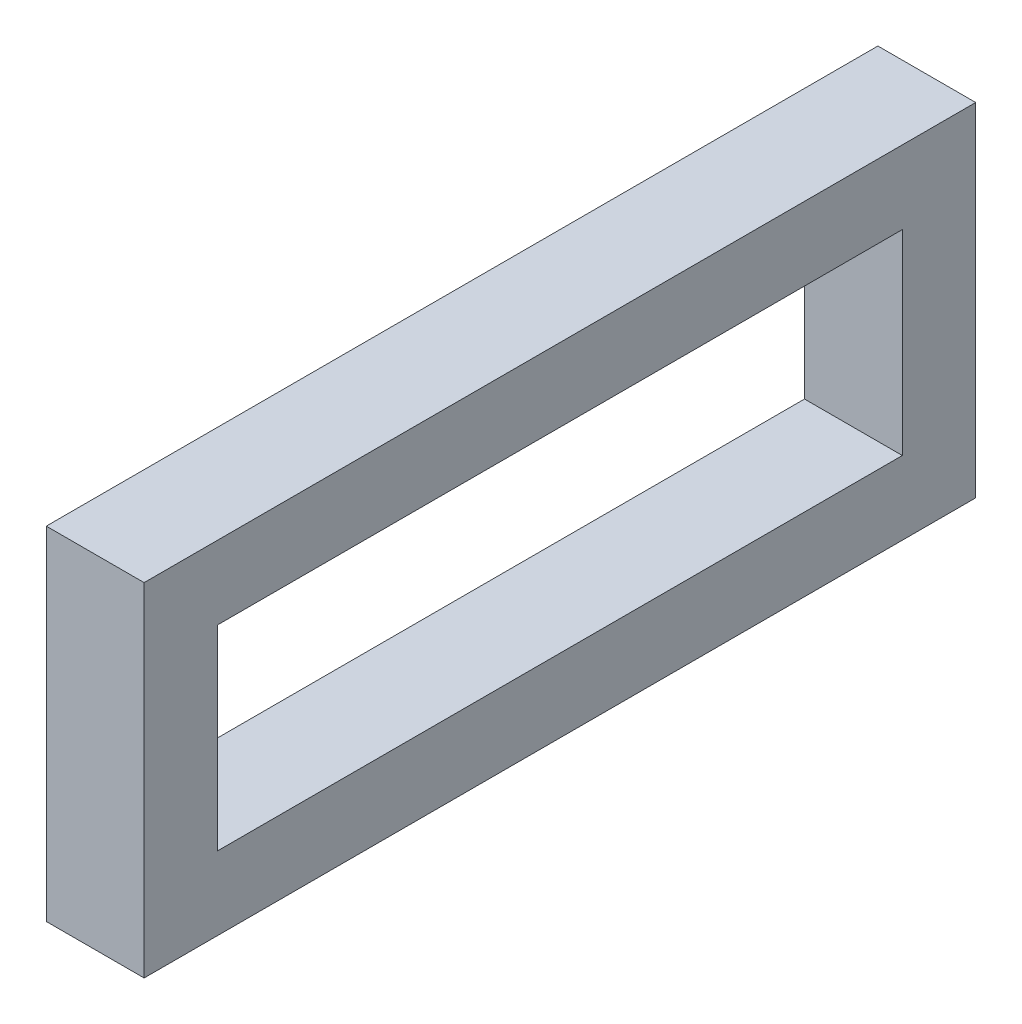
ISO-10303-21;
HEADER;
FILE_DESCRIPTION(('STEP AP214'),'2;1');
FILE_NAME('part.step','',(''),(''),'','','');
FILE_SCHEMA(('AUTOMOTIVE_DESIGN { 1 0 10303 214 1 1 1 1 }'));
ENDSEC;
DATA;
#1=APPLICATION_CONTEXT('core data for automotive mechanical design processes');
#2=APPLICATION_PROTOCOL_DEFINITION('international standard','automotive_design',2000,#1);
#3=PRODUCT_CONTEXT('',#1,'mechanical');
#4=PRODUCT('Part','Part','',(#3));
#5=PRODUCT_RELATED_PRODUCT_CATEGORY('part','',(#4));
#6=PRODUCT_DEFINITION_FORMATION('','',#4);
#7=PRODUCT_DEFINITION_CONTEXT('part definition',#1,'design');
#8=PRODUCT_DEFINITION('design','',#6,#7);
#9=PRODUCT_DEFINITION_SHAPE('','',#8);
#10=(LENGTH_UNIT() NAMED_UNIT(*) SI_UNIT(.MILLI.,.METRE.));
#11=(NAMED_UNIT(*) PLANE_ANGLE_UNIT() SI_UNIT($,.RADIAN.));
#12=(NAMED_UNIT(*) SI_UNIT($,.STERADIAN.) SOLID_ANGLE_UNIT());
#13=UNCERTAINTY_MEASURE_WITH_UNIT(LENGTH_MEASURE(1.E-05),#10,'distance_accuracy_value','');
#14=(GEOMETRIC_REPRESENTATION_CONTEXT(3) GLOBAL_UNCERTAINTY_ASSIGNED_CONTEXT((#13)) GLOBAL_UNIT_ASSIGNED_CONTEXT((#10,
#11,#12)) REPRESENTATION_CONTEXT('',''));
#15=CARTESIAN_POINT('',(0.,0.,0.));
#16=DIRECTION('',(0.,0.,1.));
#17=DIRECTION('',(1.,0.,0.));
#18=AXIS2_PLACEMENT_3D('',#15,#16,#17);
#19=CARTESIAN_POINT('',(20.,0.,0.));
#20=DIRECTION('',(1.,0.,0.));
#21=DIRECTION('',(0.,0.,-1.));
#22=AXIS2_PLACEMENT_3D('',#19,#20,#21);
#23=PLANE('',#22);
#24=DIRECTION('',(0.,-1.,0.));
#25=VECTOR('',#24,1.);
#26=CARTESIAN_POINT('',(20.,-35.,85.));
#27=LINE('',#26,#25);
#28=CARTESIAN_POINT('',(20.,35.,85.));
#29=VERTEX_POINT('',#28);
#30=CARTESIAN_POINT('',(20.,-35.,85.));
#31=VERTEX_POINT('',#30);
#32=EDGE_CURVE('E134',#29,#31,#27,.T.);
#33=ORIENTED_EDGE('',*,*,#32,.T.);
#34=DIRECTION('',(0.,0.,-1.));
#35=VECTOR('',#34,1.);
#36=CARTESIAN_POINT('',(20.,-35.,-85.));
#37=LINE('',#36,#35);
#38=CARTESIAN_POINT('',(20.,-35.,-85.));
#39=VERTEX_POINT('',#38);
#40=EDGE_CURVE('E137',#31,#39,#37,.T.);
#41=ORIENTED_EDGE('',*,*,#40,.T.);
#42=DIRECTION('',(0.,1.,0.));
#43=VECTOR('',#42,1.);
#44=CARTESIAN_POINT('',(20.,-35.,-85.));
#45=LINE('',#44,#43);
#46=CARTESIAN_POINT('',(20.,35.,-85.));
#47=VERTEX_POINT('',#46);
#48=EDGE_CURVE('E140',#39,#47,#45,.T.);
#49=ORIENTED_EDGE('',*,*,#48,.T.);
#50=DIRECTION('',(0.,0.,1.));
#51=VECTOR('',#50,1.);
#52=CARTESIAN_POINT('',(20.,35.,-85.));
#53=LINE('',#52,#51);
#54=EDGE_CURVE('E142',#47,#29,#53,.T.);
#55=ORIENTED_EDGE('',*,*,#54,.T.);
#56=EDGE_LOOP('',(#33,#41,#49,#55));
#57=FACE_BOUND('',#56,.T.);
#58=DIRECTION('',(0.,0.,-1.));
#59=VECTOR('',#58,1.);
#60=CARTESIAN_POINT('',(20.,-20.,-70.));
#61=LINE('',#60,#59);
#62=CARTESIAN_POINT('',(20.,-20.,70.));
#63=VERTEX_POINT('',#62);
#64=CARTESIAN_POINT('',(20.,-20.,-70.));
#65=VERTEX_POINT('',#64);
#66=EDGE_CURVE('E106',#63,#65,#61,.T.);
#67=ORIENTED_EDGE('',*,*,#66,.F.);
#68=DIRECTION('',(0.,-1.,0.));
#69=VECTOR('',#68,1.);
#70=CARTESIAN_POINT('',(20.,-20.,70.));
#71=LINE('',#70,#69);
#72=CARTESIAN_POINT('',(20.,20.,70.));
#73=VERTEX_POINT('',#72);
#74=EDGE_CURVE('E98',#73,#63,#71,.T.);
#75=ORIENTED_EDGE('',*,*,#74,.F.);
#76=DIRECTION('',(0.,0.,1.));
#77=VECTOR('',#76,1.);
#78=CARTESIAN_POINT('',(20.,20.,-70.));
#79=LINE('',#78,#77);
#80=CARTESIAN_POINT('',(20.,20.,-70.));
#81=VERTEX_POINT('',#80);
#82=EDGE_CURVE('E120',#81,#73,#79,.T.);
#83=ORIENTED_EDGE('',*,*,#82,.F.);
#84=DIRECTION('',(0.,1.,0.));
#85=VECTOR('',#84,1.);
#86=CARTESIAN_POINT('',(20.,-20.,-70.));
#87=LINE('',#86,#85);
#88=EDGE_CURVE('E118',#65,#81,#87,.T.);
#89=ORIENTED_EDGE('',*,*,#88,.F.);
#90=EDGE_LOOP('',(#67,#75,#83,#89));
#91=FACE_BOUND('',#90,.T.);
#92=ADVANCED_FACE('F33',(#57,#91),#23,.T.);
#93=CARTESIAN_POINT('',(0.,0.,0.));
#94=DIRECTION('',(1.,0.,0.));
#95=DIRECTION('',(0.,0.,-1.));
#96=AXIS2_PLACEMENT_3D('',#93,#94,#95);
#97=PLANE('',#96);
#98=DIRECTION('',(0.,-1.,0.));
#99=VECTOR('',#98,1.);
#100=CARTESIAN_POINT('',(0.,-35.,85.));
#101=LINE('',#100,#99);
#102=CARTESIAN_POINT('',(0.,35.,85.));
#103=VERTEX_POINT('',#102);
#104=CARTESIAN_POINT('',(0.,-35.,85.));
#105=VERTEX_POINT('',#104);
#106=EDGE_CURVE('E114',#103,#105,#101,.T.);
#107=ORIENTED_EDGE('',*,*,#106,.F.);
#108=DIRECTION('',(0.,0.,1.));
#109=VECTOR('',#108,1.);
#110=CARTESIAN_POINT('',(0.,35.,-85.));
#111=LINE('',#110,#109);
#112=CARTESIAN_POINT('',(0.,35.,-85.));
#113=VERTEX_POINT('',#112);
#114=EDGE_CURVE('E138',#113,#103,#111,.T.);
#115=ORIENTED_EDGE('',*,*,#114,.F.);
#116=DIRECTION('',(0.,1.,0.));
#117=VECTOR('',#116,1.);
#118=CARTESIAN_POINT('',(0.,-35.,-85.));
#119=LINE('',#118,#117);
#120=CARTESIAN_POINT('',(0.,-35.,-85.));
#121=VERTEX_POINT('',#120);
#122=EDGE_CURVE('E149',#121,#113,#119,.T.);
#123=ORIENTED_EDGE('',*,*,#122,.F.);
#124=DIRECTION('',(0.,0.,-1.));
#125=VECTOR('',#124,1.);
#126=CARTESIAN_POINT('',(0.,-35.,-85.));
#127=LINE('',#126,#125);
#128=EDGE_CURVE('E147',#105,#121,#127,.T.);
#129=ORIENTED_EDGE('',*,*,#128,.F.);
#130=EDGE_LOOP('',(#107,#115,#123,#129));
#131=FACE_BOUND('',#130,.T.);
#132=DIRECTION('',(0.,-1.,0.));
#133=VECTOR('',#132,1.);
#134=CARTESIAN_POINT('',(0.,-20.,70.));
#135=LINE('',#134,#133);
#136=CARTESIAN_POINT('',(0.,20.,70.));
#137=VERTEX_POINT('',#136);
#138=CARTESIAN_POINT('',(0.,-20.,70.));
#139=VERTEX_POINT('',#138);
#140=EDGE_CURVE('E56',#137,#139,#135,.T.);
#141=ORIENTED_EDGE('',*,*,#140,.T.);
#142=DIRECTION('',(0.,0.,-1.));
#143=VECTOR('',#142,1.);
#144=CARTESIAN_POINT('',(0.,-20.,-70.));
#145=LINE('',#144,#143);
#146=CARTESIAN_POINT('',(0.,-20.,-70.));
#147=VERTEX_POINT('',#146);
#148=EDGE_CURVE('E113',#139,#147,#145,.T.);
#149=ORIENTED_EDGE('',*,*,#148,.T.);
#150=DIRECTION('',(0.,1.,0.));
#151=VECTOR('',#150,1.);
#152=CARTESIAN_POINT('',(0.,-20.,-70.));
#153=LINE('',#152,#151);
#154=CARTESIAN_POINT('',(0.,20.,-70.));
#155=VERTEX_POINT('',#154);
#156=EDGE_CURVE('E126',#147,#155,#153,.T.);
#157=ORIENTED_EDGE('',*,*,#156,.T.);
#158=DIRECTION('',(0.,0.,1.));
#159=VECTOR('',#158,1.);
#160=CARTESIAN_POINT('',(0.,20.,-70.));
#161=LINE('',#160,#159);
#162=EDGE_CURVE('E107',#155,#137,#161,.T.);
#163=ORIENTED_EDGE('',*,*,#162,.T.);
#164=EDGE_LOOP('',(#141,#149,#157,#163));
#165=FACE_BOUND('',#164,.T.);
#166=ADVANCED_FACE('F167',(#131,#165),#97,.F.);
#167=CARTESIAN_POINT('',(20.,-35.,85.));
#168=DIRECTION('',(0.,0.,-1.));
#169=DIRECTION('',(-1.,0.,0.));
#170=AXIS2_PLACEMENT_3D('',#167,#168,#169);
#171=PLANE('',#170);
#172=ORIENTED_EDGE('',*,*,#106,.T.);
#173=DIRECTION('',(-1.,0.,0.));
#174=VECTOR('',#173,1.);
#175=CARTESIAN_POINT('',(20.,-35.,85.));
#176=LINE('',#175,#174);
#177=EDGE_CURVE('E11',#31,#105,#176,.T.);
#178=ORIENTED_EDGE('',*,*,#177,.F.);
#179=ORIENTED_EDGE('',*,*,#32,.F.);
#180=DIRECTION('',(-1.,0.,0.));
#181=VECTOR('',#180,1.);
#182=CARTESIAN_POINT('',(20.,35.,85.));
#183=LINE('',#182,#181);
#184=EDGE_CURVE('E144',#29,#103,#183,.T.);
#185=ORIENTED_EDGE('',*,*,#184,.T.);
#186=EDGE_LOOP('',(#172,#178,#179,#185));
#187=FACE_BOUND('',#186,.T.);
#188=ADVANCED_FACE('F35',(#187),#171,.F.);
#189=CARTESIAN_POINT('',(20.,-35.,-85.));
#190=DIRECTION('',(0.,1.,0.));
#191=DIRECTION('',(0.,0.,1.));
#192=AXIS2_PLACEMENT_3D('',#189,#190,#191);
#193=PLANE('',#192);
#194=ORIENTED_EDGE('',*,*,#128,.T.);
#195=DIRECTION('',(-1.,0.,0.));
#196=VECTOR('',#195,1.);
#197=CARTESIAN_POINT('',(20.,-35.,-85.));
#198=LINE('',#197,#196);
#199=EDGE_CURVE('E41',#39,#121,#198,.T.);
#200=ORIENTED_EDGE('',*,*,#199,.F.);
#201=ORIENTED_EDGE('',*,*,#40,.F.);
#202=ORIENTED_EDGE('',*,*,#177,.T.);
#203=EDGE_LOOP('',(#194,#200,#201,#202));
#204=FACE_BOUND('',#203,.T.);
#205=ADVANCED_FACE('F177',(#204),#193,.F.);
#206=CARTESIAN_POINT('',(20.,-35.,-85.));
#207=DIRECTION('',(0.,0.,1.));
#208=DIRECTION('',(1.,0.,0.));
#209=AXIS2_PLACEMENT_3D('',#206,#207,#208);
#210=PLANE('',#209);
#211=ORIENTED_EDGE('',*,*,#122,.T.);
#212=DIRECTION('',(-1.,0.,0.));
#213=VECTOR('',#212,1.);
#214=CARTESIAN_POINT('',(20.,35.,-85.));
#215=LINE('',#214,#213);
#216=EDGE_CURVE('E154',#47,#113,#215,.T.);
#217=ORIENTED_EDGE('',*,*,#216,.F.);
#218=ORIENTED_EDGE('',*,*,#48,.F.);
#219=ORIENTED_EDGE('',*,*,#199,.T.);
#220=EDGE_LOOP('',(#211,#217,#218,#219));
#221=FACE_BOUND('',#220,.T.);
#222=ADVANCED_FACE('F161',(#221),#210,.F.);
#223=CARTESIAN_POINT('',(20.,35.,-85.));
#224=DIRECTION('',(0.,-1.,0.));
#225=DIRECTION('',(0.,0.,-1.));
#226=AXIS2_PLACEMENT_3D('',#223,#224,#225);
#227=PLANE('',#226);
#228=ORIENTED_EDGE('',*,*,#114,.T.);
#229=ORIENTED_EDGE('',*,*,#184,.F.);
#230=ORIENTED_EDGE('',*,*,#54,.F.);
#231=ORIENTED_EDGE('',*,*,#216,.T.);
#232=EDGE_LOOP('',(#228,#229,#230,#231));
#233=FACE_BOUND('',#232,.T.);
#234=ADVANCED_FACE('F171',(#233),#227,.F.);
#235=CARTESIAN_POINT('',(20.,-20.,70.));
#236=DIRECTION('',(0.,0.,-1.));
#237=DIRECTION('',(-1.,0.,0.));
#238=AXIS2_PLACEMENT_3D('',#235,#236,#237);
#239=PLANE('',#238);
#240=ORIENTED_EDGE('',*,*,#140,.F.);
#241=DIRECTION('',(-1.,0.,0.));
#242=VECTOR('',#241,1.);
#243=CARTESIAN_POINT('',(20.,20.,70.));
#244=LINE('',#243,#242);
#245=EDGE_CURVE('E102',#73,#137,#244,.T.);
#246=ORIENTED_EDGE('',*,*,#245,.F.);
#247=ORIENTED_EDGE('',*,*,#74,.T.);
#248=DIRECTION('',(-1.,0.,0.));
#249=VECTOR('',#248,1.);
#250=CARTESIAN_POINT('',(20.,-20.,70.));
#251=LINE('',#250,#249);
#252=EDGE_CURVE('E101',#63,#139,#251,.T.);
#253=ORIENTED_EDGE('',*,*,#252,.T.);
#254=EDGE_LOOP('',(#240,#246,#247,#253));
#255=FACE_BOUND('',#254,.T.);
#256=ADVANCED_FACE('F100',(#255),#239,.T.);
#257=CARTESIAN_POINT('',(20.,-20.,-70.));
#258=DIRECTION('',(0.,1.,0.));
#259=DIRECTION('',(0.,0.,1.));
#260=AXIS2_PLACEMENT_3D('',#257,#258,#259);
#261=PLANE('',#260);
#262=ORIENTED_EDGE('',*,*,#148,.F.);
#263=ORIENTED_EDGE('',*,*,#252,.F.);
#264=ORIENTED_EDGE('',*,*,#66,.T.);
#265=DIRECTION('',(-1.,0.,0.));
#266=VECTOR('',#265,1.);
#267=CARTESIAN_POINT('',(20.,-20.,-70.));
#268=LINE('',#267,#266);
#269=EDGE_CURVE('E115',#65,#147,#268,.T.);
#270=ORIENTED_EDGE('',*,*,#269,.T.);
#271=EDGE_LOOP('',(#262,#263,#264,#270));
#272=FACE_BOUND('',#271,.T.);
#273=ADVANCED_FACE('F110',(#272),#261,.T.);
#274=CARTESIAN_POINT('',(20.,-20.,-70.));
#275=DIRECTION('',(0.,0.,1.));
#276=DIRECTION('',(1.,0.,0.));
#277=AXIS2_PLACEMENT_3D('',#274,#275,#276);
#278=PLANE('',#277);
#279=ORIENTED_EDGE('',*,*,#156,.F.);
#280=ORIENTED_EDGE('',*,*,#269,.F.);
#281=ORIENTED_EDGE('',*,*,#88,.T.);
#282=DIRECTION('',(-1.,0.,0.));
#283=VECTOR('',#282,1.);
#284=CARTESIAN_POINT('',(20.,20.,-70.));
#285=LINE('',#284,#283);
#286=EDGE_CURVE('E48',#81,#155,#285,.T.);
#287=ORIENTED_EDGE('',*,*,#286,.T.);
#288=EDGE_LOOP('',(#279,#280,#281,#287));
#289=FACE_BOUND('',#288,.T.);
#290=ADVANCED_FACE('F200',(#289),#278,.T.);
#291=CARTESIAN_POINT('',(20.,20.,-70.));
#292=DIRECTION('',(0.,-1.,0.));
#293=DIRECTION('',(0.,0.,-1.));
#294=AXIS2_PLACEMENT_3D('',#291,#292,#293);
#295=PLANE('',#294);
#296=ORIENTED_EDGE('',*,*,#162,.F.);
#297=ORIENTED_EDGE('',*,*,#286,.F.);
#298=ORIENTED_EDGE('',*,*,#82,.T.);
#299=ORIENTED_EDGE('',*,*,#245,.T.);
#300=EDGE_LOOP('',(#296,#297,#298,#299));
#301=FACE_BOUND('',#300,.T.);
#302=ADVANCED_FACE('F204',(#301),#295,.T.);
#303=CLOSED_SHELL('',(#92,#166,#188,#205,#222,#234,#256,#273,#290,#302));
#304=MANIFOLD_SOLID_BREP('B2',#303);
#305=ADVANCED_BREP_SHAPE_REPRESENTATION('',(#18,#304),#14);
#306=SHAPE_DEFINITION_REPRESENTATION(#9,#305);
ENDSEC;
END-ISO-10303-21;
